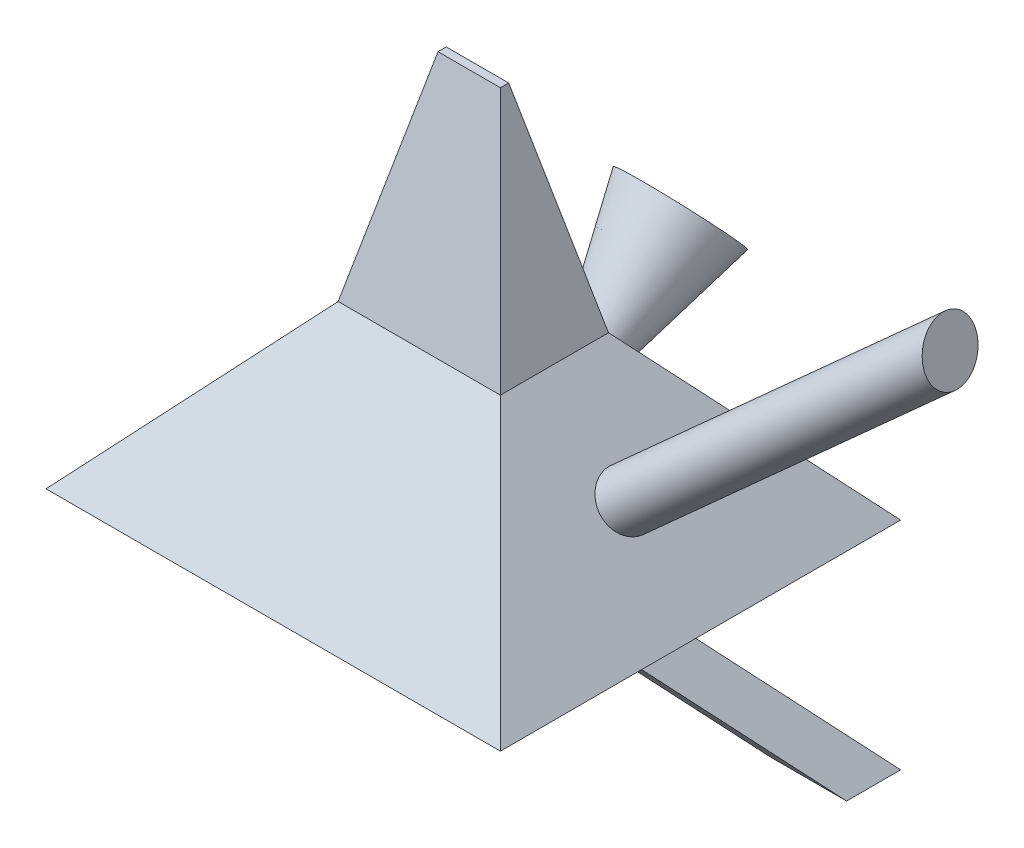
ISO-10303-21;
HEADER;
FILE_DESCRIPTION(('STEP AP214'),'2;1');
FILE_NAME('part.step','',(''),(''),'','','');
FILE_SCHEMA(('AUTOMOTIVE_DESIGN { 1 0 10303 214 1 1 1 1 }'));
ENDSEC;
DATA;
#1=APPLICATION_CONTEXT('core data for automotive mechanical design processes');
#2=APPLICATION_PROTOCOL_DEFINITION('international standard','automotive_design',2000,#1);
#3=PRODUCT_CONTEXT('',#1,'mechanical');
#4=PRODUCT('Part','Part','',(#3));
#5=PRODUCT_RELATED_PRODUCT_CATEGORY('part','',(#4));
#6=PRODUCT_DEFINITION_FORMATION('','',#4);
#7=PRODUCT_DEFINITION_CONTEXT('part definition',#1,'design');
#8=PRODUCT_DEFINITION('design','',#6,#7);
#9=PRODUCT_DEFINITION_SHAPE('','',#8);
#10=(LENGTH_UNIT() NAMED_UNIT(*) SI_UNIT(.MILLI.,.METRE.));
#11=(NAMED_UNIT(*) PLANE_ANGLE_UNIT() SI_UNIT($,.RADIAN.));
#12=(NAMED_UNIT(*) SI_UNIT($,.STERADIAN.) SOLID_ANGLE_UNIT());
#13=UNCERTAINTY_MEASURE_WITH_UNIT(LENGTH_MEASURE(1.E-05),#10,'distance_accuracy_value','');
#14=(GEOMETRIC_REPRESENTATION_CONTEXT(3) GLOBAL_UNCERTAINTY_ASSIGNED_CONTEXT((#13)) GLOBAL_UNIT_ASSIGNED_CONTEXT((#10,
#11,#12)) REPRESENTATION_CONTEXT('',''));
#15=CARTESIAN_POINT('',(0.,0.,0.));
#16=DIRECTION('',(0.,0.,1.));
#17=DIRECTION('',(1.,0.,0.));
#18=AXIS2_PLACEMENT_3D('',#15,#16,#17);
#19=CARTESIAN_POINT('',(0.,-750.,0.));
#20=DIRECTION('',(0.,1.,0.));
#21=DIRECTION('',(0.,0.,1.));
#22=AXIS2_PLACEMENT_3D('',#19,#20,#21);
#23=PLANE('',#22);
#24=DIRECTION('',(-1.,0.,0.));
#25=VECTOR('',#24,1.);
#26=CARTESIAN_POINT('',(0.,-750.,-925.303033223382));
#27=LINE('',#26,#25);
#28=CARTESIAN_POINT('',(1050.30303322338,-750.,-925.303033223382));
#29=VERTEX_POINT('',#28);
#30=CARTESIAN_POINT('',(-1050.30303322338,-750.,-925.303033223382));
#31=VERTEX_POINT('',#30);
#32=EDGE_CURVE('E232',#29,#31,#27,.T.);
#33=ORIENTED_EDGE('',*,*,#32,.F.);
#34=DIRECTION('',(0.,0.,-1.));
#35=VECTOR('',#34,1.);
#36=CARTESIAN_POINT('',(1050.30303322338,-750.,0.));
#37=LINE('',#36,#35);
#38=CARTESIAN_POINT('',(1050.30303322338,-750.,925.303033223382));
#39=VERTEX_POINT('',#38);
#40=EDGE_CURVE('E237',#39,#29,#37,.T.);
#41=ORIENTED_EDGE('',*,*,#40,.F.);
#42=DIRECTION('',(1.,0.,0.));
#43=VECTOR('',#42,1.);
#44=CARTESIAN_POINT('',(0.,-750.,925.303033223382));
#45=LINE('',#44,#43);
#46=CARTESIAN_POINT('',(-1050.30303322338,-750.,925.303033223382));
#47=VERTEX_POINT('',#46);
#48=EDGE_CURVE('E243',#47,#39,#45,.T.);
#49=ORIENTED_EDGE('',*,*,#48,.F.);
#50=DIRECTION('',(0.,0.,1.));
#51=VECTOR('',#50,1.);
#52=CARTESIAN_POINT('',(-1050.30303322338,-750.,0.));
#53=LINE('',#52,#51);
#54=EDGE_CURVE('E76',#31,#47,#53,.T.);
#55=ORIENTED_EDGE('',*,*,#54,.F.);
#56=EDGE_LOOP('',(#33,#41,#49,#55));
#57=FACE_BOUND('',#56,.T.);
#58=DIRECTION('',(-1.,0.,0.));
#59=VECTOR('',#58,1.);
#60=CARTESIAN_POINT('',(700.303033223382,-750.,-24.898988925539));
#61=LINE('',#60,#59);
#62=CARTESIAN_POINT('',(149.898988925539,-750.,-24.8989889255389));
#63=VERTEX_POINT('',#62);
#64=CARTESIAN_POINT('',(-200.101011074461,-750.,-24.898988925539));
#65=VERTEX_POINT('',#64);
#66=EDGE_CURVE('E146',#63,#65,#61,.T.);
#67=ORIENTED_EDGE('',*,*,#66,.T.);
#68=DIRECTION('',(0.,0.,1.));
#69=VECTOR('',#68,1.);
#70=CARTESIAN_POINT('',(-200.101011074461,-750.,-675.303033223382));
#71=LINE('',#70,#69);
#72=CARTESIAN_POINT('',(-200.101011074461,-750.,225.101011074461));
#73=VERTEX_POINT('',#72);
#74=EDGE_CURVE('E148',#65,#73,#71,.T.);
#75=ORIENTED_EDGE('',*,*,#74,.T.);
#76=DIRECTION('',(1.,0.,0.));
#77=VECTOR('',#76,1.);
#78=CARTESIAN_POINT('',(1050.30303322338,-750.,225.101011074461));
#79=LINE('',#78,#77);
#80=CARTESIAN_POINT('',(149.898988925539,-750.,225.101011074461));
#81=VERTEX_POINT('',#80);
#82=EDGE_CURVE('E94',#73,#81,#79,.T.);
#83=ORIENTED_EDGE('',*,*,#82,.T.);
#84=DIRECTION('',(0.,0.,-1.));
#85=VECTOR('',#84,1.);
#86=CARTESIAN_POINT('',(149.898988925539,-750.,-925.303033223382));
#87=LINE('',#86,#85);
#88=EDGE_CURVE('E89',#81,#63,#87,.T.);
#89=ORIENTED_EDGE('',*,*,#88,.T.);
#90=EDGE_LOOP('',(#67,#75,#83,#89));
#91=FACE_BOUND('',#90,.T.);
#92=ADVANCED_FACE('F72',(#57,#91),#23,.F.);
#93=CARTESIAN_POINT('',(375.,0.,-250.));
#94=DIRECTION('',(0.,0.669130606358859,-0.743144825477393));
#95=DIRECTION('',(0.,0.743144825477393,0.669130606358859));
#96=AXIS2_PLACEMENT_3D('',#93,#94,#95);
#97=PLANE('',#96);
#98=CARTESIAN_POINT('',(0.,-374.999999999886,-587.6515166118));
#99=DIRECTION('',(0.,0.669130606358859,-0.743144825477393));
#100=DIRECTION('',(0.,0.743144825477393,0.669130606358859));
#101=AXIS2_PLACEMENT_3D('',#98,#99,#100);
#102=CIRCLE('',#101,125.);
#103=CARTESIAN_POINT('',(0.,-282.106896815212,-504.010190816942));
#104=VERTEX_POINT('',#103);
#105=EDGE_CURVE('E312',#104,#104,#102,.T.);
#106=ORIENTED_EDGE('',*,*,#105,.F.);
#107=EDGE_LOOP('',(#106));
#108=FACE_BOUND('',#107,.T.);
#109=DIRECTION('',(-1.,0.,0.));
#110=VECTOR('',#109,1.);
#111=CARTESIAN_POINT('',(375.,0.,-250.));
#112=LINE('',#111,#110);
#113=CARTESIAN_POINT('',(375.,0.,-250.));
#114=VERTEX_POINT('',#113);
#115=CARTESIAN_POINT('',(-375.,0.,-250.));
#116=VERTEX_POINT('',#115);
#117=EDGE_CURVE('E204',#114,#116,#112,.T.);
#118=ORIENTED_EDGE('',*,*,#117,.F.);
#119=DIRECTION('',(-0.556117091816005,0.617630601881269,0.556117091816005));
#120=VECTOR('',#119,1.);
#121=CARTESIAN_POINT('',(220.366890095055,171.73746706739,-95.3668900950546));
#122=LINE('',#121,#120);
#123=EDGE_CURVE('E13',#29,#114,#122,.T.);
#124=ORIENTED_EDGE('',*,*,#123,.F.);
#125=ORIENTED_EDGE('',*,*,#32,.T.);
#126=DIRECTION('',(0.556117091816005,0.617630601881269,0.556117091816005));
#127=VECTOR('',#126,1.);
#128=CARTESIAN_POINT('',(-143.050335142582,257.606200601085,-18.0503351425818));
#129=LINE('',#128,#127);
#130=EDGE_CURVE('E234',#31,#116,#129,.T.);
#131=ORIENTED_EDGE('',*,*,#130,.T.);
#132=EDGE_LOOP('',(#118,#124,#125,#131));
#133=FACE_BOUND('',#132,.T.);
#134=ADVANCED_FACE('F257',(#108,#133),#97,.T.);
#135=CARTESIAN_POINT('',(375.,0.,250.));
#136=DIRECTION('',(0.743144825477393,0.669130606358859,0.));
#137=DIRECTION('',(-0.669130606358859,0.743144825477393,0.));
#138=AXIS2_PLACEMENT_3D('',#135,#136,#137);
#139=PLANE('',#138);
#140=CARTESIAN_POINT('',(712.651516611691,-375.,0.));
#141=DIRECTION('',(0.743144825477393,0.669130606358859,0.));
#142=DIRECTION('',(-0.669130606358859,0.743144825477393,0.));
#143=AXIS2_PLACEMENT_3D('',#140,#141,#142);
#144=CIRCLE('',#143,125.);
#145=CARTESIAN_POINT('',(629.010190816834,-282.106896815326,0.));
#146=VERTEX_POINT('',#145);
#147=EDGE_CURVE('E307',#146,#146,#144,.T.);
#148=ORIENTED_EDGE('',*,*,#147,.F.);
#149=EDGE_LOOP('',(#148));
#150=FACE_BOUND('',#149,.T.);
#151=DIRECTION('',(0.,0.,-1.));
#152=VECTOR('',#151,1.);
#153=CARTESIAN_POINT('',(375.,0.,250.));
#154=LINE('',#153,#152);
#155=CARTESIAN_POINT('',(375.,0.,250.));
#156=VERTEX_POINT('',#155);
#157=EDGE_CURVE('E230',#156,#114,#154,.T.);
#158=ORIENTED_EDGE('',*,*,#157,.F.);
#159=DIRECTION('',(-0.556117091816005,0.617630601881269,-0.556117091816005));
#160=VECTOR('',#159,1.);
#161=CARTESIAN_POINT('',(143.050335142582,257.606200601085,18.0503351425818));
#162=LINE('',#161,#160);
#163=EDGE_CURVE('E81',#39,#156,#162,.T.);
#164=ORIENTED_EDGE('',*,*,#163,.F.);
#165=ORIENTED_EDGE('',*,*,#40,.T.);
#166=ORIENTED_EDGE('',*,*,#123,.T.);
#167=EDGE_LOOP('',(#158,#164,#165,#166));
#168=FACE_BOUND('',#167,.T.);
#169=ADVANCED_FACE('F74',(#150,#168),#139,.T.);
#170=CARTESIAN_POINT('',(-375.,0.,250.));
#171=DIRECTION('',(0.,0.669130606358859,0.743144825477393));
#172=DIRECTION('',(0.,-0.743144825477393,0.669130606358859));
#173=AXIS2_PLACEMENT_3D('',#170,#171,#172);
#174=PLANE('',#173);
#175=DIRECTION('',(1.,0.,0.));
#176=VECTOR('',#175,1.);
#177=CARTESIAN_POINT('',(-375.,0.,250.));
#178=LINE('',#177,#176);
#179=CARTESIAN_POINT('',(-375.,0.,250.));
#180=VERTEX_POINT('',#179);
#181=EDGE_CURVE('E227',#180,#156,#178,.T.);
#182=ORIENTED_EDGE('',*,*,#181,.F.);
#183=DIRECTION('',(0.556117091816005,0.617630601881269,-0.556117091816005));
#184=VECTOR('',#183,1.);
#185=CARTESIAN_POINT('',(-220.366890095055,171.73746706739,95.3668900950546));
#186=LINE('',#185,#184);
#187=EDGE_CURVE('E236',#47,#180,#186,.T.);
#188=ORIENTED_EDGE('',*,*,#187,.F.);
#189=ORIENTED_EDGE('',*,*,#48,.T.);
#190=ORIENTED_EDGE('',*,*,#163,.T.);
#191=EDGE_LOOP('',(#182,#188,#189,#190));
#192=FACE_BOUND('',#191,.T.);
#193=ADVANCED_FACE('F275',(#192),#174,.T.);
#194=CARTESIAN_POINT('',(-375.,0.,-250.));
#195=DIRECTION('',(-0.743144825477393,0.669130606358859,0.));
#196=DIRECTION('',(-0.669130606358859,-0.743144825477393,0.));
#197=AXIS2_PLACEMENT_3D('',#194,#195,#196);
#198=PLANE('',#197);
#199=DIRECTION('',(0.,0.,1.));
#200=VECTOR('',#199,1.);
#201=CARTESIAN_POINT('',(-375.,0.,-250.));
#202=LINE('',#201,#200);
#203=EDGE_CURVE('E224',#116,#180,#202,.T.);
#204=ORIENTED_EDGE('',*,*,#203,.F.);
#205=ORIENTED_EDGE('',*,*,#130,.F.);
#206=ORIENTED_EDGE('',*,*,#54,.T.);
#207=ORIENTED_EDGE('',*,*,#187,.T.);
#208=EDGE_LOOP('',(#204,#205,#206,#207));
#209=FACE_BOUND('',#208,.T.);
#210=ADVANCED_FACE('F252',(#209),#198,.T.);
#211=CARTESIAN_POINT('',(375.,0.,-250.));
#212=DIRECTION('',(0.,0.224951054343866,-0.974370064785235));
#213=DIRECTION('',(0.,0.974370064785235,0.224951054343866));
#214=AXIS2_PLACEMENT_3D('',#211,#212,#213);
#215=PLANE('',#214);
#216=ORIENTED_EDGE('',*,*,#117,.T.);
#217=DIRECTION('',(-0.219466743499904,-0.950614904677543,-0.219466743499904));
#218=VECTOR('',#217,1.);
#219=CARTESIAN_POINT('',(-375.,0.,-250.));
#220=LINE('',#219,#218);
#221=CARTESIAN_POINT('',(-144.131808874436,1000.,-19.1318088744364));
#222=VERTEX_POINT('',#221);
#223=EDGE_CURVE('E201',#222,#116,#220,.T.);
#224=ORIENTED_EDGE('',*,*,#223,.F.);
#225=DIRECTION('',(1.,0.,0.));
#226=VECTOR('',#225,1.);
#227=CARTESIAN_POINT('',(375.,1000.,-19.1318088744364));
#228=LINE('',#227,#226);
#229=CARTESIAN_POINT('',(144.131808874436,1000.,-19.1318088744364));
#230=VERTEX_POINT('',#229);
#231=EDGE_CURVE('E153',#230,#222,#228,.F.);
#232=ORIENTED_EDGE('',*,*,#231,.F.);
#233=DIRECTION('',(0.219466743499904,-0.950614904677543,-0.219466743499904));
#234=VECTOR('',#233,1.);
#235=CARTESIAN_POINT('',(375.,0.,-250.));
#236=LINE('',#235,#234);
#237=EDGE_CURVE('E206',#230,#114,#236,.T.);
#238=ORIENTED_EDGE('',*,*,#237,.T.);
#239=EDGE_LOOP('',(#216,#224,#232,#238));
#240=FACE_BOUND('',#239,.T.);
#241=ADVANCED_FACE('F267',(#240),#215,.T.);
#242=CARTESIAN_POINT('',(-375.,0.,-250.));
#243=DIRECTION('',(-0.974370064785235,0.224951054343866,0.));
#244=DIRECTION('',(-0.224951054343866,-0.974370064785235,0.));
#245=AXIS2_PLACEMENT_3D('',#242,#243,#244);
#246=PLANE('',#245);
#247=ORIENTED_EDGE('',*,*,#203,.T.);
#248=DIRECTION('',(-0.219466743499904,-0.950614904677543,0.219466743499904));
#249=VECTOR('',#248,1.);
#250=CARTESIAN_POINT('',(-375.,0.,250.));
#251=LINE('',#250,#249);
#252=CARTESIAN_POINT('',(-144.131808874436,1000.,19.1318088744364));
#253=VERTEX_POINT('',#252);
#254=EDGE_CURVE('E205',#253,#180,#251,.T.);
#255=ORIENTED_EDGE('',*,*,#254,.F.);
#256=DIRECTION('',(0.,0.,-1.));
#257=VECTOR('',#256,1.);
#258=CARTESIAN_POINT('',(-144.131808874436,1000.,-250.));
#259=LINE('',#258,#257);
#260=EDGE_CURVE('E217',#222,#253,#259,.F.);
#261=ORIENTED_EDGE('',*,*,#260,.F.);
#262=ORIENTED_EDGE('',*,*,#223,.T.);
#263=EDGE_LOOP('',(#247,#255,#261,#262));
#264=FACE_BOUND('',#263,.T.);
#265=ADVANCED_FACE('F277',(#264),#246,.T.);
#266=CARTESIAN_POINT('',(-375.,0.,250.));
#267=DIRECTION('',(0.,0.224951054343866,0.974370064785235));
#268=DIRECTION('',(0.,-0.974370064785235,0.224951054343866));
#269=AXIS2_PLACEMENT_3D('',#266,#267,#268);
#270=PLANE('',#269);
#271=ORIENTED_EDGE('',*,*,#181,.T.);
#272=DIRECTION('',(0.219466743499904,-0.950614904677543,0.219466743499904));
#273=VECTOR('',#272,1.);
#274=CARTESIAN_POINT('',(375.,0.,250.));
#275=LINE('',#274,#273);
#276=CARTESIAN_POINT('',(144.131808874436,1000.,19.1318088744364));
#277=VERTEX_POINT('',#276);
#278=EDGE_CURVE('E209',#277,#156,#275,.T.);
#279=ORIENTED_EDGE('',*,*,#278,.F.);
#280=DIRECTION('',(-1.,0.,0.));
#281=VECTOR('',#280,1.);
#282=CARTESIAN_POINT('',(-375.,1000.,19.1318088744364));
#283=LINE('',#282,#281);
#284=EDGE_CURVE('E219',#253,#277,#283,.F.);
#285=ORIENTED_EDGE('',*,*,#284,.F.);
#286=ORIENTED_EDGE('',*,*,#254,.T.);
#287=EDGE_LOOP('',(#271,#279,#285,#286));
#288=FACE_BOUND('',#287,.T.);
#289=ADVANCED_FACE('F274',(#288),#270,.T.);
#290=CARTESIAN_POINT('',(375.,0.,250.));
#291=DIRECTION('',(0.974370064785235,0.224951054343866,0.));
#292=DIRECTION('',(-0.224951054343866,0.974370064785235,0.));
#293=AXIS2_PLACEMENT_3D('',#290,#291,#292);
#294=PLANE('',#293);
#295=ORIENTED_EDGE('',*,*,#157,.T.);
#296=ORIENTED_EDGE('',*,*,#237,.F.);
#297=DIRECTION('',(0.,0.,1.));
#298=VECTOR('',#297,1.);
#299=CARTESIAN_POINT('',(144.131808874436,1000.,250.));
#300=LINE('',#299,#298);
#301=EDGE_CURVE('E210',#277,#230,#300,.F.);
#302=ORIENTED_EDGE('',*,*,#301,.F.);
#303=ORIENTED_EDGE('',*,*,#278,.T.);
#304=EDGE_LOOP('',(#295,#296,#302,#303));
#305=FACE_BOUND('',#304,.T.);
#306=ADVANCED_FACE('F262',(#305),#294,.T.);
#307=CARTESIAN_POINT('',(0.,1000.,0.));
#308=DIRECTION('',(0.,1.,0.));
#309=DIRECTION('',(0.,0.,1.));
#310=AXIS2_PLACEMENT_3D('',#307,#308,#309);
#311=PLANE('',#310);
#312=ORIENTED_EDGE('',*,*,#231,.T.);
#313=ORIENTED_EDGE('',*,*,#260,.T.);
#314=ORIENTED_EDGE('',*,*,#284,.T.);
#315=ORIENTED_EDGE('',*,*,#301,.T.);
#316=EDGE_LOOP('',(#312,#313,#314,#315));
#317=FACE_BOUND('',#316,.T.);
#318=ADVANCED_FACE('F270',(#317),#311,.T.);
#319=CARTESIAN_POINT('',(7.32195221796298E-12,-1750.00000000001,-6.10162684830249E-12));
#320=DIRECTION('',(0.,1.,0.));
#321=DIRECTION('',(-1.,0.,0.));
#322=AXIS2_PLACEMENT_3D('',#319,#320,#321);
#323=PLANE('',#322);
#324=DIRECTION('',(1.,0.,0.));
#325=VECTOR('',#324,1.);
#326=CARTESIAN_POINT('',(700.303033223382,-1750.,-925.303033223382));
#327=LINE('',#326,#325);
#328=CARTESIAN_POINT('',(700.303033223382,-1750.,-925.303033223382));
#329=VERTEX_POINT('',#328);
#330=CARTESIAN_POINT('',(1050.30303322338,-1750.,-925.303033223382));
#331=VERTEX_POINT('',#330);
#332=EDGE_CURVE('E154',#329,#331,#327,.T.);
#333=ORIENTED_EDGE('',*,*,#332,.T.);
#334=DIRECTION('',(0.,0.,1.));
#335=VECTOR('',#334,1.);
#336=CARTESIAN_POINT('',(1050.30303322338,-1750.,-925.303033223382));
#337=LINE('',#336,#335);
#338=CARTESIAN_POINT('',(1050.30303322338,-1750.,-675.303033223382));
#339=VERTEX_POINT('',#338);
#340=EDGE_CURVE('E181',#331,#339,#337,.T.);
#341=ORIENTED_EDGE('',*,*,#340,.T.);
#342=DIRECTION('',(-1.,0.,0.));
#343=VECTOR('',#342,1.);
#344=CARTESIAN_POINT('',(1050.30303322338,-1750.,-675.303033223382));
#345=LINE('',#344,#343);
#346=CARTESIAN_POINT('',(700.303033223382,-1750.,-675.303033223382));
#347=VERTEX_POINT('',#346);
#348=EDGE_CURVE('E171',#339,#347,#345,.T.);
#349=ORIENTED_EDGE('',*,*,#348,.T.);
#350=DIRECTION('',(0.,0.,-1.));
#351=VECTOR('',#350,1.);
#352=CARTESIAN_POINT('',(700.303033223382,-1750.,-675.303033223382));
#353=LINE('',#352,#351);
#354=EDGE_CURVE('E168',#347,#329,#353,.T.);
#355=ORIENTED_EDGE('',*,*,#354,.T.);
#356=EDGE_LOOP('',(#333,#341,#349,#355));
#357=FACE_BOUND('',#356,.T.);
#358=ADVANCED_FACE('F348',(#357),#323,.F.);
#359=CARTESIAN_POINT('',(700.303033223382,-1750.,-925.303033223382));
#360=DIRECTION('',(0.,-0.66913060635886,0.743144825477393));
#361=DIRECTION('',(0.,-0.743144825477393,-0.66913060635886));
#362=AXIS2_PLACEMENT_3D('',#359,#360,#361);
#363=PLANE('',#362);
#364=ORIENTED_EDGE('',*,*,#66,.F.);
#365=DIRECTION('',(-0.556117091816005,0.617630601881269,0.556117091816005));
#366=VECTOR('',#365,1.);
#367=CARTESIAN_POINT('',(1050.30303322338,-1750.,-925.303033223382));
#368=LINE('',#367,#366);
#369=EDGE_CURVE('E184',#331,#63,#368,.T.);
#370=ORIENTED_EDGE('',*,*,#369,.F.);
#371=ORIENTED_EDGE('',*,*,#332,.F.);
#372=DIRECTION('',(-0.556117091816005,0.617630601881269,0.556117091816005));
#373=VECTOR('',#372,1.);
#374=CARTESIAN_POINT('',(700.303033223382,-1750.,-925.303033223382));
#375=LINE('',#374,#373);
#376=EDGE_CURVE('E160',#329,#65,#375,.T.);
#377=ORIENTED_EDGE('',*,*,#376,.T.);
#378=EDGE_LOOP('',(#364,#370,#371,#377));
#379=FACE_BOUND('',#378,.T.);
#380=ADVANCED_FACE('F165',(#379),#363,.F.);
#381=CARTESIAN_POINT('',(1050.30303322338,-1750.,-925.303033223382));
#382=DIRECTION('',(-0.743144825477393,-0.669130606358859,0.));
#383=DIRECTION('',(0.669130606358859,-0.743144825477393,0.));
#384=AXIS2_PLACEMENT_3D('',#381,#382,#383);
#385=PLANE('',#384);
#386=ORIENTED_EDGE('',*,*,#88,.F.);
#387=DIRECTION('',(-0.556117091816005,0.617630601881269,0.556117091816005));
#388=VECTOR('',#387,1.);
#389=CARTESIAN_POINT('',(1050.30303322338,-1750.,-675.303033223382));
#390=LINE('',#389,#388);
#391=EDGE_CURVE('E167',#339,#81,#390,.T.);
#392=ORIENTED_EDGE('',*,*,#391,.F.);
#393=ORIENTED_EDGE('',*,*,#340,.F.);
#394=ORIENTED_EDGE('',*,*,#369,.T.);
#395=EDGE_LOOP('',(#386,#392,#393,#394));
#396=FACE_BOUND('',#395,.T.);
#397=ADVANCED_FACE('F341',(#396),#385,.F.);
#398=CARTESIAN_POINT('',(1050.30303322338,-1750.,-675.303033223382));
#399=DIRECTION('',(0.,0.66913060635886,-0.743144825477393));
#400=DIRECTION('',(0.,0.743144825477393,0.66913060635886));
#401=AXIS2_PLACEMENT_3D('',#398,#399,#400);
#402=PLANE('',#401);
#403=ORIENTED_EDGE('',*,*,#82,.F.);
#404=DIRECTION('',(-0.556117091816005,0.617630601881269,0.556117091816005));
#405=VECTOR('',#404,1.);
#406=CARTESIAN_POINT('',(700.303033223382,-1750.,-675.303033223382));
#407=LINE('',#406,#405);
#408=EDGE_CURVE('E163',#347,#73,#407,.T.);
#409=ORIENTED_EDGE('',*,*,#408,.F.);
#410=ORIENTED_EDGE('',*,*,#348,.F.);
#411=ORIENTED_EDGE('',*,*,#391,.T.);
#412=EDGE_LOOP('',(#403,#409,#410,#411));
#413=FACE_BOUND('',#412,.T.);
#414=ADVANCED_FACE('F335',(#413),#402,.F.);
#415=CARTESIAN_POINT('',(700.303033223382,-1750.,-675.303033223382));
#416=DIRECTION('',(0.743144825477393,0.669130606358859,0.));
#417=DIRECTION('',(-0.669130606358859,0.743144825477393,0.));
#418=AXIS2_PLACEMENT_3D('',#415,#416,#417);
#419=PLANE('',#418);
#420=ORIENTED_EDGE('',*,*,#74,.F.);
#421=ORIENTED_EDGE('',*,*,#376,.F.);
#422=ORIENTED_EDGE('',*,*,#354,.F.);
#423=ORIENTED_EDGE('',*,*,#408,.T.);
#424=EDGE_LOOP('',(#420,#421,#422,#423));
#425=FACE_BOUND('',#424,.T.);
#426=ADVANCED_FACE('F159',(#425),#419,.F.);
#427=CARTESIAN_POINT('',(0.,-374.999999999886,-587.6515166118));
#428=DIRECTION('',(0.,0.669130606358859,-0.743144825477393));
#429=DIRECTION('',(0.,0.743144825477393,0.669130606358859));
#430=AXIS2_PLACEMENT_3D('',#427,#428,#429);
#431=CONICAL_SURFACE('',#430,125.,0.26179938779915);
#432=CARTESIAN_POINT('',(0.,-42.0659671429317,-957.412220115286));
#433=DIRECTION('',(0.,0.669130606358859,-0.743144825477393));
#434=DIRECTION('',(0.,0.743144825477393,0.669130606358859));
#435=AXIS2_PLACEMENT_3D('',#432,#433,#434);
#436=CIRCLE('',#435,258.321364153853);
#437=CARTESIAN_POINT('',(0.,149.904217938266,-784.561489083571));
#438=VERTEX_POINT('',#437);
#439=EDGE_CURVE('E317',#438,#438,#436,.T.);
#440=ORIENTED_EDGE('',*,*,#439,.F.);
#441=EDGE_LOOP('',(#440));
#442=FACE_BOUND('',#441,.T.);
#443=ORIENTED_EDGE('',*,*,#105,.T.);
#444=EDGE_LOOP('',(#443));
#445=FACE_BOUND('',#444,.T.);
#446=ADVANCED_FACE('F324',(#442,#445),#431,.T.);
#447=CARTESIAN_POINT('',(0.,-42.0659671429317,-957.412220115286));
#448=DIRECTION('',(0.,0.669130606358859,-0.743144825477393));
#449=DIRECTION('',(0.,0.743144825477393,0.669130606358859));
#450=AXIS2_PLACEMENT_3D('',#447,#448,#449);
#451=PLANE('',#450);
#452=ORIENTED_EDGE('',*,*,#439,.T.);
#453=EDGE_LOOP('',(#452));
#454=FACE_BOUND('',#453,.T.);
#455=ADVANCED_FACE('F322',(#454),#451,.T.);
#456=CARTESIAN_POINT('',(3972.00448676936,2559.73459612415,0.));
#457=DIRECTION('',(-0.743144825477393,-0.669130606358859,0.));
#458=DIRECTION('',(0.669130606358859,-0.743144825477393,0.));
#459=AXIS2_PLACEMENT_3D('',#456,#457,#458);
#460=CYLINDRICAL_SURFACE('',#459,125.);
#461=CARTESIAN_POINT('',(2204.14094077408,967.943109543271,0.));
#462=DIRECTION('',(0.974370064785235,0.224951054343866,0.));
#463=DIRECTION('',(0.224951054343866,-0.974370064785235,0.));
#464=AXIS2_PLACEMENT_3D('',#461,#462,#463);
#465=ELLIPSE('',#464,142.919258484165,125.);
#466=CARTESIAN_POINT('',(2236.29077865613,828.686862394998,0.));
#467=VERTEX_POINT('',#466);
#468=EDGE_CURVE('E309',#467,#467,#465,.F.);
#469=ORIENTED_EDGE('',*,*,#468,.T.);
#470=EDGE_LOOP('',(#469));
#471=FACE_BOUND('',#470,.T.);
#472=ORIENTED_EDGE('',*,*,#147,.T.);
#473=EDGE_LOOP('',(#472));
#474=FACE_BOUND('',#473,.T.);
#475=ADVANCED_FACE('F333',(#471,#474),#460,.T.);
#476=CARTESIAN_POINT('',(2323.74012957047,449.902108687731,250.));
#477=DIRECTION('',(0.974370064785235,0.224951054343866,0.));
#478=DIRECTION('',(-0.224951054343866,0.974370064785235,0.));
#479=AXIS2_PLACEMENT_3D('',#476,#477,#478);
#480=PLANE('',#479);
#481=ORIENTED_EDGE('',*,*,#468,.F.);
#482=EDGE_LOOP('',(#481));
#483=FACE_BOUND('',#482,.T.);
#484=ADVANCED_FACE('F406',(#483),#480,.T.);
#485=CLOSED_SHELL('',(#92,#134,#169,#193,#210,#241,#265,#289,#306,#318,#358,#380,#397,#414,#426,
#446,#455,#475,#484));
#486=MANIFOLD_SOLID_BREP('B2',#485);
#487=ADVANCED_BREP_SHAPE_REPRESENTATION('',(#18,#486),#14);
#488=SHAPE_DEFINITION_REPRESENTATION(#9,#487);
ENDSEC;
END-ISO-10303-21;
